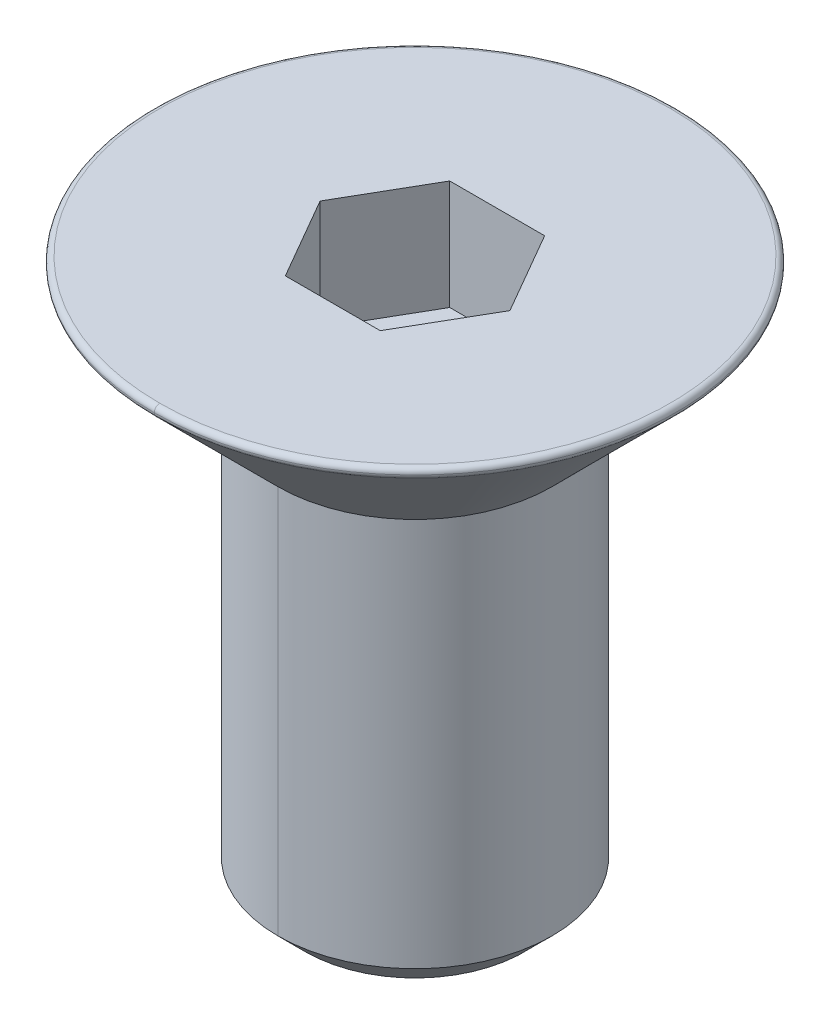
ISO-10303-21;
HEADER;
FILE_DESCRIPTION(('STEP AP214'),'2;1');
FILE_NAME('part.step','',(''),(''),'','','');
FILE_SCHEMA(('AUTOMOTIVE_DESIGN { 1 0 10303 214 1 1 1 1 }'));
ENDSEC;
DATA;
#1=APPLICATION_CONTEXT('core data for automotive mechanical design processes');
#2=APPLICATION_PROTOCOL_DEFINITION('international standard','automotive_design',2000,#1);
#3=PRODUCT_CONTEXT('',#1,'mechanical');
#4=PRODUCT('Part','Part','',(#3));
#5=PRODUCT_RELATED_PRODUCT_CATEGORY('part','',(#4));
#6=PRODUCT_DEFINITION_FORMATION('','',#4);
#7=PRODUCT_DEFINITION_CONTEXT('part definition',#1,'design');
#8=PRODUCT_DEFINITION('design','',#6,#7);
#9=PRODUCT_DEFINITION_SHAPE('','',#8);
#10=(LENGTH_UNIT() NAMED_UNIT(*) SI_UNIT(.MILLI.,.METRE.));
#11=(NAMED_UNIT(*) PLANE_ANGLE_UNIT() SI_UNIT($,.RADIAN.));
#12=(NAMED_UNIT(*) SI_UNIT($,.STERADIAN.) SOLID_ANGLE_UNIT());
#13=UNCERTAINTY_MEASURE_WITH_UNIT(LENGTH_MEASURE(1.E-05),#10,'distance_accuracy_value','');
#14=(GEOMETRIC_REPRESENTATION_CONTEXT(3) GLOBAL_UNCERTAINTY_ASSIGNED_CONTEXT((#13)) GLOBAL_UNIT_ASSIGNED_CONTEXT((#10,
#11,#12)) REPRESENTATION_CONTEXT('',''));
#15=CARTESIAN_POINT('',(0.,0.,0.));
#16=DIRECTION('',(0.,0.,1.));
#17=DIRECTION('',(1.,0.,0.));
#18=AXIS2_PLACEMENT_3D('',#15,#16,#17);
#19=CARTESIAN_POINT('',(0.,0.,0.));
#20=DIRECTION('',(0.,-1.,0.));
#21=DIRECTION('',(0.,0.,-1.));
#22=AXIS2_PLACEMENT_3D('',#19,#20,#21);
#23=PLANE('',#22);
#24=CARTESIAN_POINT('',(0.,-5.6843418860808E-11,0.));
#25=DIRECTION('',(0.,1.,0.));
#26=DIRECTION('',(0.,0.,1.));
#27=AXIS2_PLACEMENT_3D('',#24,#25,#26);
#28=CIRCLE('',#27,2.00000000000955);
#29=CARTESIAN_POINT('',(0.,-5.6843418860808E-11,2.00000000000955));
#30=VERTEX_POINT('',#29);
#31=CARTESIAN_POINT('',(0.,-5.6843418860808E-11,-2.00000000000955));
#32=VERTEX_POINT('',#31);
#33=EDGE_CURVE('E21',#30,#32,#28,.T.);
#34=ORIENTED_EDGE('',*,*,#33,.F.);
#35=CARTESIAN_POINT('',(0.,-5.6843418860808E-11,0.));
#36=DIRECTION('',(0.,1.,0.));
#37=DIRECTION('',(0.,0.,1.));
#38=AXIS2_PLACEMENT_3D('',#35,#36,#37);
#39=CIRCLE('',#38,2.00000000000955);
#40=EDGE_CURVE('E112',#32,#30,#39,.T.);
#41=ORIENTED_EDGE('',*,*,#40,.F.);
#42=EDGE_LOOP('',(#34,#41));
#43=FACE_BOUND('',#42,.T.);
#44=ADVANCED_FACE('F17',(#43),#23,.T.);
#45=CARTESIAN_POINT('',(0.,0.499999999988177,0.));
#46=DIRECTION('',(0.,1.,0.));
#47=DIRECTION('',(0.,0.,1.));
#48=AXIS2_PLACEMENT_3D('',#45,#46,#47);
#49=CONICAL_SURFACE('',#48,2.49999999994088,0.785398163283761);
#50=CARTESIAN_POINT('',(0.,0.500000000000005,0.));
#51=DIRECTION('',(0.,-1.,0.));
#52=DIRECTION('',(0.,0.,-1.));
#53=AXIS2_PLACEMENT_3D('',#50,#51,#52);
#54=CIRCLE('',#53,2.5);
#55=CARTESIAN_POINT('',(0.,0.499999999997048,2.49999999998522));
#56=VERTEX_POINT('',#55);
#57=CARTESIAN_POINT('',(0.,0.499999999997048,-2.49999999998522));
#58=VERTEX_POINT('',#57);
#59=EDGE_CURVE('E127',#56,#58,#54,.F.);
#60=ORIENTED_EDGE('',*,*,#59,.F.);
#61=DIRECTION('',(0.,-0.707106781226742,-0.707106781146353));
#62=VECTOR('',#61,1.);
#63=CARTESIAN_POINT('',(0.,498998.00005673,499000.));
#64=LINE('',#63,#62);
#65=EDGE_CURVE('E110',#30,#56,#64,.F.);
#66=ORIENTED_EDGE('',*,*,#65,.F.);
#67=ORIENTED_EDGE('',*,*,#33,.T.);
#68=DIRECTION('',(0.,-0.707106781226742,0.707106781146353));
#69=VECTOR('',#68,1.);
#70=CARTESIAN_POINT('',(6.11098752774529E-11,498998.00005673,-499000.));
#71=LINE('',#70,#69);
#72=EDGE_CURVE('E107',#58,#32,#71,.T.);
#73=ORIENTED_EDGE('',*,*,#72,.F.);
#74=EDGE_LOOP('',(#60,#66,#67,#73));
#75=FACE_BOUND('',#74,.T.);
#76=ADVANCED_FACE('F105',(#75),#49,.T.);
#77=CARTESIAN_POINT('',(0.,0.499999999988177,0.));
#78=DIRECTION('',(0.,1.,0.));
#79=DIRECTION('',(0.,0.,1.));
#80=AXIS2_PLACEMENT_3D('',#77,#78,#79);
#81=CONICAL_SURFACE('',#80,2.49999999994088,0.785398163283761);
#82=ORIENTED_EDGE('',*,*,#65,.T.);
#83=CARTESIAN_POINT('',(0.,0.500000000000005,0.));
#84=DIRECTION('',(0.,-1.,0.));
#85=DIRECTION('',(0.,0.,-1.));
#86=AXIS2_PLACEMENT_3D('',#83,#84,#85);
#87=CIRCLE('',#86,2.5);
#88=EDGE_CURVE('E117',#58,#56,#87,.F.);
#89=ORIENTED_EDGE('',*,*,#88,.F.);
#90=ORIENTED_EDGE('',*,*,#72,.T.);
#91=ORIENTED_EDGE('',*,*,#40,.T.);
#92=EDGE_LOOP('',(#82,#89,#90,#91));
#93=FACE_BOUND('',#92,.T.);
#94=ADVANCED_FACE('F115',(#93),#81,.T.);
#95=CARTESIAN_POINT('',(0.,0.,0.));
#96=DIRECTION('',(0.,-1.,0.));
#97=DIRECTION('',(0.,0.,-1.));
#98=AXIS2_PLACEMENT_3D('',#95,#96,#97);
#99=CYLINDRICAL_SURFACE('',#98,2.5);
#100=ORIENTED_EDGE('',*,*,#59,.T.);
#101=DIRECTION('',(0.,-1.,0.));
#102=VECTOR('',#101,1.);
#103=CARTESIAN_POINT('',(0.,0.,-2.5));
#104=LINE('',#103,#102);
#105=CARTESIAN_POINT('',(0.,7.60000000008176,-2.49999999999829));
#106=VERTEX_POINT('',#105);
#107=EDGE_CURVE('E243',#106,#58,#104,.T.);
#108=ORIENTED_EDGE('',*,*,#107,.F.);
#109=CARTESIAN_POINT('',(0.,7.60000000008176,0.));
#110=DIRECTION('',(0.,1.,0.));
#111=DIRECTION('',(0.,0.,1.));
#112=AXIS2_PLACEMENT_3D('',#109,#110,#111);
#113=CIRCLE('',#112,2.49999999999773);
#114=CARTESIAN_POINT('',(0.,7.60000000006755,2.49999999999829));
#115=VERTEX_POINT('',#114);
#116=EDGE_CURVE('E225',#115,#106,#113,.T.);
#117=ORIENTED_EDGE('',*,*,#116,.F.);
#118=DIRECTION('',(0.,-1.,0.));
#119=VECTOR('',#118,1.);
#120=CARTESIAN_POINT('',(0.,0.,2.5));
#121=LINE('',#120,#119);
#122=EDGE_CURVE('E240',#56,#115,#121,.F.);
#123=ORIENTED_EDGE('',*,*,#122,.F.);
#124=EDGE_LOOP('',(#100,#108,#117,#123));
#125=FACE_BOUND('',#124,.T.);
#126=ADVANCED_FACE('F257',(#125),#99,.T.);
#127=CARTESIAN_POINT('',(0.,0.,0.));
#128=DIRECTION('',(0.,-1.,0.));
#129=DIRECTION('',(0.,0.,-1.));
#130=AXIS2_PLACEMENT_3D('',#127,#128,#129);
#131=CYLINDRICAL_SURFACE('',#130,2.5);
#132=ORIENTED_EDGE('',*,*,#107,.T.);
#133=ORIENTED_EDGE('',*,*,#88,.T.);
#134=ORIENTED_EDGE('',*,*,#122,.T.);
#135=CARTESIAN_POINT('',(0.,7.60000000008176,0.));
#136=DIRECTION('',(0.,1.,0.));
#137=DIRECTION('',(0.,0.,1.));
#138=AXIS2_PLACEMENT_3D('',#135,#136,#137);
#139=CIRCLE('',#138,2.49999999999773);
#140=EDGE_CURVE('E219',#106,#115,#139,.T.);
#141=ORIENTED_EDGE('',*,*,#140,.F.);
#142=EDGE_LOOP('',(#132,#133,#134,#141));
#143=FACE_BOUND('',#142,.T.);
#144=ADVANCED_FACE('F252',(#143),#131,.T.);
#145=CARTESIAN_POINT('',(0.866025403784438,8.,1.5));
#146=DIRECTION('',(0.866025403784439,0.,0.5));
#147=DIRECTION('',(0.5,0.,-0.866025403784439));
#148=AXIS2_PLACEMENT_3D('',#145,#146,#147);
#149=PLANE('',#148);
#150=DIRECTION('',(0.5,0.,-0.866025403784439));
#151=VECTOR('',#150,1.);
#152=CARTESIAN_POINT('',(0.866025403784438,8.,1.5));
#153=LINE('',#152,#151);
#154=CARTESIAN_POINT('',(0.866025403784438,8.,1.5));
#155=VERTEX_POINT('',#154);
#156=CARTESIAN_POINT('',(1.73205080756888,8.,0.));
#157=VERTEX_POINT('',#156);
#158=EDGE_CURVE('E228',#155,#157,#153,.T.);
#159=ORIENTED_EDGE('',*,*,#158,.F.);
#160=DIRECTION('',(0.,1.,0.));
#161=VECTOR('',#160,1.);
#162=CARTESIAN_POINT('',(0.866025403784439,8.,1.5));
#163=LINE('',#162,#161);
#164=CARTESIAN_POINT('',(0.866025403784438,10.,1.5));
#165=VERTEX_POINT('',#164);
#166=EDGE_CURVE('E196',#155,#165,#163,.T.);
#167=ORIENTED_EDGE('',*,*,#166,.T.);
#168=DIRECTION('',(0.5,0.,-0.866025403784439));
#169=VECTOR('',#168,1.);
#170=CARTESIAN_POINT('',(0.866025403784438,10.,1.5));
#171=LINE('',#170,#169);
#172=CARTESIAN_POINT('',(1.73205080756888,10.,0.));
#173=VERTEX_POINT('',#172);
#174=EDGE_CURVE('E230',#173,#165,#171,.F.);
#175=ORIENTED_EDGE('',*,*,#174,.F.);
#176=DIRECTION('',(0.,1.,0.));
#177=VECTOR('',#176,1.);
#178=CARTESIAN_POINT('',(1.73205080756888,8.,0.));
#179=LINE('',#178,#177);
#180=EDGE_CURVE('E203',#173,#157,#179,.F.);
#181=ORIENTED_EDGE('',*,*,#180,.T.);
#182=EDGE_LOOP('',(#159,#167,#175,#181));
#183=FACE_BOUND('',#182,.T.);
#184=ADVANCED_FACE('F308',(#183),#149,.F.);
#185=CARTESIAN_POINT('',(0.,9.82928932194227,0.));
#186=DIRECTION('',(0.,1.,0.));
#187=DIRECTION('',(0.,0.,1.));
#188=AXIS2_PLACEMENT_3D('',#185,#186,#187);
#189=CONICAL_SURFACE('',#188,4.72928932174455,0.78539816337195);
#190=CARTESIAN_POINT('',(0.,9.82928932183933,0.));
#191=DIRECTION('',(0.,1.,0.));
#192=DIRECTION('',(0.,0.,1.));
#193=AXIS2_PLACEMENT_3D('',#190,#191,#192);
#194=CIRCLE('',#193,4.72928932183933);
#195=CARTESIAN_POINT('',(0.,9.82928932186506,4.72928932181563));
#196=VERTEX_POINT('',#195);
#197=CARTESIAN_POINT('',(0.,9.82928932187927,-4.72928932184405));
#198=VERTEX_POINT('',#197);
#199=EDGE_CURVE('E193',#196,#198,#194,.T.);
#200=ORIENTED_EDGE('',*,*,#199,.F.);
#201=DIRECTION('',(0.,-0.707106781195563,-0.707106781177532));
#202=VECTOR('',#201,1.);
#203=CARTESIAN_POINT('',(0.,499000.,498994.899987276));
#204=LINE('',#203,#202);
#205=EDGE_CURVE('E208',#115,#196,#204,.F.);
#206=ORIENTED_EDGE('',*,*,#205,.F.);
#207=ORIENTED_EDGE('',*,*,#116,.T.);
#208=DIRECTION('',(0.,-0.707106781195563,0.707106781177532));
#209=VECTOR('',#208,1.);
#210=CARTESIAN_POINT('',(6.11092507060272E-11,499000.,-498994.899987276));
#211=LINE('',#210,#209);
#212=EDGE_CURVE('E222',#198,#106,#211,.T.);
#213=ORIENTED_EDGE('',*,*,#212,.F.);
#214=EDGE_LOOP('',(#200,#206,#207,#213));
#215=FACE_BOUND('',#214,.T.);
#216=ADVANCED_FACE('F259',(#215),#189,.T.);
#217=CARTESIAN_POINT('',(0.,9.82928932194227,0.));
#218=DIRECTION('',(0.,1.,0.));
#219=DIRECTION('',(0.,0.,1.));
#220=AXIS2_PLACEMENT_3D('',#217,#218,#219);
#221=CONICAL_SURFACE('',#220,4.72928932174455,0.78539816337195);
#222=ORIENTED_EDGE('',*,*,#205,.T.);
#223=CARTESIAN_POINT('',(0.,9.82928932183933,0.));
#224=DIRECTION('',(0.,1.,0.));
#225=DIRECTION('',(0.,0.,1.));
#226=AXIS2_PLACEMENT_3D('',#223,#224,#225);
#227=CIRCLE('',#226,4.72928932183933);
#228=EDGE_CURVE('E187',#198,#196,#227,.T.);
#229=ORIENTED_EDGE('',*,*,#228,.F.);
#230=ORIENTED_EDGE('',*,*,#212,.T.);
#231=ORIENTED_EDGE('',*,*,#140,.T.);
#232=EDGE_LOOP('',(#222,#229,#230,#231));
#233=FACE_BOUND('',#232,.T.);
#234=ADVANCED_FACE('F263',(#233),#221,.T.);
#235=CARTESIAN_POINT('',(1.73205080756888,8.,0.));
#236=DIRECTION('',(0.866025403784438,0.,-0.5));
#237=DIRECTION('',(-0.5,0.,-0.866025403784438));
#238=AXIS2_PLACEMENT_3D('',#235,#236,#237);
#239=PLANE('',#238);
#240=DIRECTION('',(-0.5,0.,-0.866025403784438));
#241=VECTOR('',#240,1.);
#242=CARTESIAN_POINT('',(1.73205080756888,8.,0.));
#243=LINE('',#242,#241);
#244=CARTESIAN_POINT('',(0.866025403784438,8.,-1.5));
#245=VERTEX_POINT('',#244);
#246=EDGE_CURVE('E201',#157,#245,#243,.T.);
#247=ORIENTED_EDGE('',*,*,#246,.F.);
#248=ORIENTED_EDGE('',*,*,#180,.F.);
#249=DIRECTION('',(-0.5,0.,-0.866025403784438));
#250=VECTOR('',#249,1.);
#251=CARTESIAN_POINT('',(1.73205080756888,10.,0.));
#252=LINE('',#251,#250);
#253=CARTESIAN_POINT('',(0.866025403784438,10.,-1.5));
#254=VERTEX_POINT('',#253);
#255=EDGE_CURVE('E206',#254,#173,#252,.F.);
#256=ORIENTED_EDGE('',*,*,#255,.F.);
#257=DIRECTION('',(0.,1.,0.));
#258=VECTOR('',#257,1.);
#259=CARTESIAN_POINT('',(0.866025403784438,8.,-1.5));
#260=LINE('',#259,#258);
#261=EDGE_CURVE('E171',#254,#245,#260,.F.);
#262=ORIENTED_EDGE('',*,*,#261,.T.);
#263=EDGE_LOOP('',(#247,#248,#256,#262));
#264=FACE_BOUND('',#263,.T.);
#265=ADVANCED_FACE('F299',(#264),#239,.F.);
#266=CARTESIAN_POINT('',(-0.866025403784439,8.,1.5));
#267=DIRECTION('',(0.,0.,1.));
#268=DIRECTION('',(1.,0.,0.));
#269=AXIS2_PLACEMENT_3D('',#266,#267,#268);
#270=PLANE('',#269);
#271=DIRECTION('',(1.,0.,0.));
#272=VECTOR('',#271,1.);
#273=CARTESIAN_POINT('',(1.73205080756888,8.,1.5));
#274=LINE('',#273,#272);
#275=CARTESIAN_POINT('',(-0.866025403784439,8.,1.5));
#276=VERTEX_POINT('',#275);
#277=EDGE_CURVE('E168',#276,#155,#274,.T.);
#278=ORIENTED_EDGE('',*,*,#277,.F.);
#279=DIRECTION('',(0.,1.,0.));
#280=VECTOR('',#279,1.);
#281=CARTESIAN_POINT('',(-0.866025403784439,8.,1.5));
#282=LINE('',#281,#280);
#283=CARTESIAN_POINT('',(-0.866025403784439,10.,1.5));
#284=VERTEX_POINT('',#283);
#285=EDGE_CURVE('E158',#276,#284,#282,.T.);
#286=ORIENTED_EDGE('',*,*,#285,.T.);
#287=DIRECTION('',(1.,0.,0.));
#288=VECTOR('',#287,1.);
#289=CARTESIAN_POINT('',(-0.866025403784439,10.,1.5));
#290=LINE('',#289,#288);
#291=EDGE_CURVE('E199',#165,#284,#290,.F.);
#292=ORIENTED_EDGE('',*,*,#291,.F.);
#293=ORIENTED_EDGE('',*,*,#166,.F.);
#294=EDGE_LOOP('',(#278,#286,#292,#293));
#295=FACE_BOUND('',#294,.T.);
#296=ADVANCED_FACE('F296',(#295),#270,.F.);
#297=CARTESIAN_POINT('',(0.,9.9,0.));
#298=DIRECTION('',(0.,1.,0.));
#299=DIRECTION('',(0.,0.,1.));
#300=AXIS2_PLACEMENT_3D('',#297,#298,#299);
#301=TOROIDAL_SURFACE('',#300,4.65857864376271,0.0999999999999858);
#302=CARTESIAN_POINT('',(0.,9.9,4.65857864376271));
#303=DIRECTION('',(-1.,0.,0.));
#304=DIRECTION('',(0.,0.,1.));
#305=AXIS2_PLACEMENT_3D('',#302,#303,#304);
#306=CIRCLE('',#305,0.0999999999999858);
#307=CARTESIAN_POINT('',(0.,9.9,4.75857864376269));
#308=VERTEX_POINT('',#307);
#309=EDGE_CURVE('E176',#196,#308,#306,.T.);
#310=ORIENTED_EDGE('',*,*,#309,.F.);
#311=ORIENTED_EDGE('',*,*,#199,.T.);
#312=CARTESIAN_POINT('',(0.,9.9,-4.65857864376271));
#313=DIRECTION('',(-1.,0.,0.));
#314=DIRECTION('',(0.,0.,1.));
#315=AXIS2_PLACEMENT_3D('',#312,#313,#314);
#316=CIRCLE('',#315,0.0999999999999858);
#317=CARTESIAN_POINT('',(0.,9.9,-4.75857864376269));
#318=VERTEX_POINT('',#317);
#319=EDGE_CURVE('E190',#318,#198,#316,.T.);
#320=ORIENTED_EDGE('',*,*,#319,.F.);
#321=CARTESIAN_POINT('',(0.,9.9,0.));
#322=DIRECTION('',(0.,1.,0.));
#323=DIRECTION('',(0.,0.,1.));
#324=AXIS2_PLACEMENT_3D('',#321,#322,#323);
#325=CIRCLE('',#324,4.75857864376269);
#326=EDGE_CURVE('E155',#308,#318,#325,.T.);
#327=ORIENTED_EDGE('',*,*,#326,.F.);
#328=EDGE_LOOP('',(#310,#311,#320,#327));
#329=FACE_BOUND('',#328,.T.);
#330=ADVANCED_FACE('F268',(#329),#301,.T.);
#331=CARTESIAN_POINT('',(0.,9.9,0.));
#332=DIRECTION('',(0.,1.,0.));
#333=DIRECTION('',(0.,0.,1.));
#334=AXIS2_PLACEMENT_3D('',#331,#332,#333);
#335=TOROIDAL_SURFACE('',#334,4.65857864376271,0.0999999999999858);
#336=ORIENTED_EDGE('',*,*,#228,.T.);
#337=ORIENTED_EDGE('',*,*,#309,.T.);
#338=CARTESIAN_POINT('',(0.,9.9,0.));
#339=DIRECTION('',(0.,1.,0.));
#340=DIRECTION('',(0.,0.,1.));
#341=AXIS2_PLACEMENT_3D('',#338,#339,#340);
#342=CIRCLE('',#341,4.75857864376269);
#343=EDGE_CURVE('E149',#318,#308,#342,.T.);
#344=ORIENTED_EDGE('',*,*,#343,.F.);
#345=ORIENTED_EDGE('',*,*,#319,.T.);
#346=EDGE_LOOP('',(#336,#337,#344,#345));
#347=FACE_BOUND('',#346,.T.);
#348=ADVANCED_FACE('F266',(#347),#335,.T.);
#349=CARTESIAN_POINT('',(0.866025403784438,8.,-1.5));
#350=DIRECTION('',(0.,0.,-1.));
#351=DIRECTION('',(-1.,0.,0.));
#352=AXIS2_PLACEMENT_3D('',#349,#350,#351);
#353=PLANE('',#352);
#354=DIRECTION('',(1.,0.,0.));
#355=VECTOR('',#354,1.);
#356=CARTESIAN_POINT('',(1.73205080756888,8.,-1.5));
#357=LINE('',#356,#355);
#358=CARTESIAN_POINT('',(-0.866025403784439,8.,-1.5));
#359=VERTEX_POINT('',#358);
#360=EDGE_CURVE('E165',#245,#359,#357,.F.);
#361=ORIENTED_EDGE('',*,*,#360,.F.);
#362=ORIENTED_EDGE('',*,*,#261,.F.);
#363=DIRECTION('',(-1.,0.,0.));
#364=VECTOR('',#363,1.);
#365=CARTESIAN_POINT('',(0.866025403784438,10.,-1.5));
#366=LINE('',#365,#364);
#367=CARTESIAN_POINT('',(-0.866025403784439,10.,-1.5));
#368=VERTEX_POINT('',#367);
#369=EDGE_CURVE('E174',#368,#254,#366,.F.);
#370=ORIENTED_EDGE('',*,*,#369,.F.);
#371=DIRECTION('',(0.,1.,0.));
#372=VECTOR('',#371,1.);
#373=CARTESIAN_POINT('',(-0.866025403784439,8.,-1.5));
#374=LINE('',#373,#372);
#375=EDGE_CURVE('E142',#368,#359,#374,.F.);
#376=ORIENTED_EDGE('',*,*,#375,.T.);
#377=EDGE_LOOP('',(#361,#362,#370,#376));
#378=FACE_BOUND('',#377,.T.);
#379=ADVANCED_FACE('F291',(#378),#353,.F.);
#380=CARTESIAN_POINT('',(1.73205080756888,8.,0.));
#381=DIRECTION('',(0.,1.,0.));
#382=DIRECTION('',(0.,0.,1.));
#383=AXIS2_PLACEMENT_3D('',#380,#381,#382);
#384=PLANE('',#383);
#385=ORIENTED_EDGE('',*,*,#360,.T.);
#386=DIRECTION('',(-0.5,0.,0.866025403784439));
#387=VECTOR('',#386,1.);
#388=CARTESIAN_POINT('',(-0.866025403784439,8.,-1.5));
#389=LINE('',#388,#387);
#390=CARTESIAN_POINT('',(-1.73205080756888,8.,0.));
#391=VERTEX_POINT('',#390);
#392=EDGE_CURVE('E136',#359,#391,#389,.T.);
#393=ORIENTED_EDGE('',*,*,#392,.T.);
#394=DIRECTION('',(0.5,0.,0.866025403784439));
#395=VECTOR('',#394,1.);
#396=CARTESIAN_POINT('',(-1.73205080756888,8.,0.));
#397=LINE('',#396,#395);
#398=EDGE_CURVE('E161',#391,#276,#397,.T.);
#399=ORIENTED_EDGE('',*,*,#398,.T.);
#400=ORIENTED_EDGE('',*,*,#277,.T.);
#401=ORIENTED_EDGE('',*,*,#158,.T.);
#402=ORIENTED_EDGE('',*,*,#246,.T.);
#403=EDGE_LOOP('',(#385,#393,#399,#400,#401,#402));
#404=FACE_BOUND('',#403,.T.);
#405=ADVANCED_FACE('F288',(#404),#384,.T.);
#406=CARTESIAN_POINT('',(-1.73205080756888,8.,0.));
#407=DIRECTION('',(-0.866025403784439,0.,0.5));
#408=DIRECTION('',(0.5,0.,0.866025403784439));
#409=AXIS2_PLACEMENT_3D('',#406,#407,#408);
#410=PLANE('',#409);
#411=ORIENTED_EDGE('',*,*,#398,.F.);
#412=DIRECTION('',(0.,1.,0.));
#413=VECTOR('',#412,1.);
#414=CARTESIAN_POINT('',(-1.73205080756888,8.,0.));
#415=LINE('',#414,#413);
#416=CARTESIAN_POINT('',(-1.73205080756888,10.,0.));
#417=VERTEX_POINT('',#416);
#418=EDGE_CURVE('E134',#391,#417,#415,.T.);
#419=ORIENTED_EDGE('',*,*,#418,.T.);
#420=DIRECTION('',(0.5,0.,0.866025403784439));
#421=VECTOR('',#420,1.);
#422=CARTESIAN_POINT('',(-1.73205080756888,10.,0.));
#423=LINE('',#422,#421);
#424=EDGE_CURVE('E35',#284,#417,#423,.F.);
#425=ORIENTED_EDGE('',*,*,#424,.F.);
#426=ORIENTED_EDGE('',*,*,#285,.F.);
#427=EDGE_LOOP('',(#411,#419,#425,#426));
#428=FACE_BOUND('',#427,.T.);
#429=ADVANCED_FACE('F285',(#428),#410,.F.);
#430=CARTESIAN_POINT('',(0.,9.9,0.));
#431=DIRECTION('',(0.,1.,0.));
#432=DIRECTION('',(0.,0.,1.));
#433=AXIS2_PLACEMENT_3D('',#430,#431,#432);
#434=TOROIDAL_SURFACE('',#433,4.65857864376269,0.0999999999999998);
#435=CARTESIAN_POINT('',(0.,9.9,4.65857864376269));
#436=DIRECTION('',(-1.,0.,0.));
#437=DIRECTION('',(0.,0.,1.));
#438=AXIS2_PLACEMENT_3D('',#435,#436,#437);
#439=CIRCLE('',#438,0.0999999999999998);
#440=CARTESIAN_POINT('',(0.,10.,4.65857864376269));
#441=VERTEX_POINT('',#440);
#442=EDGE_CURVE('E146',#308,#441,#439,.T.);
#443=ORIENTED_EDGE('',*,*,#442,.F.);
#444=ORIENTED_EDGE('',*,*,#326,.T.);
#445=CARTESIAN_POINT('',(0.,9.9,-4.65857864376269));
#446=DIRECTION('',(-1.,0.,0.));
#447=DIRECTION('',(0.,0.,1.));
#448=AXIS2_PLACEMENT_3D('',#445,#446,#447);
#449=CIRCLE('',#448,0.0999999999999998);
#450=CARTESIAN_POINT('',(0.,10.,-4.65857864376269));
#451=VERTEX_POINT('',#450);
#452=EDGE_CURVE('E152',#451,#318,#449,.T.);
#453=ORIENTED_EDGE('',*,*,#452,.F.);
#454=CARTESIAN_POINT('',(0.,10.,0.));
#455=DIRECTION('',(0.,1.,0.));
#456=DIRECTION('',(0.,0.,1.));
#457=AXIS2_PLACEMENT_3D('',#454,#455,#456);
#458=CIRCLE('',#457,4.65857864376269);
#459=EDGE_CURVE('E132',#441,#451,#458,.T.);
#460=ORIENTED_EDGE('',*,*,#459,.F.);
#461=EDGE_LOOP('',(#443,#444,#453,#460));
#462=FACE_BOUND('',#461,.T.);
#463=ADVANCED_FACE('F271',(#462),#434,.T.);
#464=CARTESIAN_POINT('',(0.,9.9,0.));
#465=DIRECTION('',(0.,1.,0.));
#466=DIRECTION('',(0.,0.,1.));
#467=AXIS2_PLACEMENT_3D('',#464,#465,#466);
#468=TOROIDAL_SURFACE('',#467,4.65857864376269,0.0999999999999998);
#469=ORIENTED_EDGE('',*,*,#343,.T.);
#470=ORIENTED_EDGE('',*,*,#442,.T.);
#471=CARTESIAN_POINT('',(0.,10.,0.));
#472=DIRECTION('',(0.,1.,0.));
#473=DIRECTION('',(0.,0.,1.));
#474=AXIS2_PLACEMENT_3D('',#471,#472,#473);
#475=CIRCLE('',#474,4.65857864376269);
#476=EDGE_CURVE('E27',#451,#441,#475,.T.);
#477=ORIENTED_EDGE('',*,*,#476,.F.);
#478=ORIENTED_EDGE('',*,*,#452,.T.);
#479=EDGE_LOOP('',(#469,#470,#477,#478));
#480=FACE_BOUND('',#479,.T.);
#481=ADVANCED_FACE('F19',(#480),#468,.T.);
#482=CARTESIAN_POINT('',(-0.866025403784439,8.,-1.5));
#483=DIRECTION('',(-0.866025403784439,0.,-0.5));
#484=DIRECTION('',(-0.5,0.,0.866025403784439));
#485=AXIS2_PLACEMENT_3D('',#482,#483,#484);
#486=PLANE('',#485);
#487=ORIENTED_EDGE('',*,*,#392,.F.);
#488=ORIENTED_EDGE('',*,*,#375,.F.);
#489=DIRECTION('',(0.5,0.,-0.866025403784439));
#490=VECTOR('',#489,1.);
#491=CARTESIAN_POINT('',(-1.73205080756888,10.,0.));
#492=LINE('',#491,#490);
#493=EDGE_CURVE('E11',#417,#368,#492,.T.);
#494=ORIENTED_EDGE('',*,*,#493,.F.);
#495=ORIENTED_EDGE('',*,*,#418,.F.);
#496=EDGE_LOOP('',(#487,#488,#494,#495));
#497=FACE_BOUND('',#496,.T.);
#498=ADVANCED_FACE('F276',(#497),#486,.F.);
#499=CARTESIAN_POINT('',(0.,10.,-4.9));
#500=DIRECTION('',(0.,1.,0.));
#501=DIRECTION('',(0.,0.,1.));
#502=AXIS2_PLACEMENT_3D('',#499,#500,#501);
#503=PLANE('',#502);
#504=ORIENTED_EDGE('',*,*,#424,.T.);
#505=ORIENTED_EDGE('',*,*,#493,.T.);
#506=ORIENTED_EDGE('',*,*,#369,.T.);
#507=ORIENTED_EDGE('',*,*,#255,.T.);
#508=ORIENTED_EDGE('',*,*,#174,.T.);
#509=ORIENTED_EDGE('',*,*,#291,.T.);
#510=EDGE_LOOP('',(#504,#505,#506,#507,#508,#509));
#511=FACE_BOUND('',#510,.T.);
#512=ORIENTED_EDGE('',*,*,#459,.T.);
#513=ORIENTED_EDGE('',*,*,#476,.T.);
#514=EDGE_LOOP('',(#512,#513));
#515=FACE_BOUND('',#514,.T.);
#516=ADVANCED_FACE('F274',(#511,#515),#503,.T.);
#517=CLOSED_SHELL('',(#44,#76,#94,#126,#144,#184,#216,#234,#265,#296,#330,#348,#379,#405,#429,
#463,#481,#498,#516));
#518=MANIFOLD_SOLID_BREP('B1',#517);
#519=ADVANCED_BREP_SHAPE_REPRESENTATION('',(#18,#518),#14);
#520=SHAPE_DEFINITION_REPRESENTATION(#9,#519);
ENDSEC;
END-ISO-10303-21;
